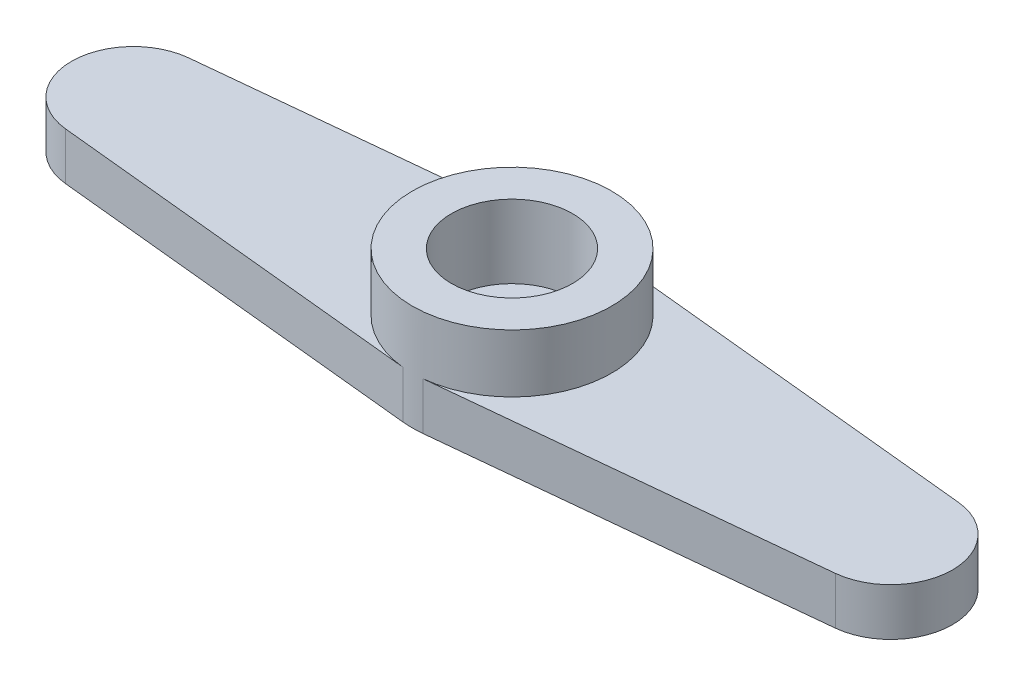
ISO-10303-21;
HEADER;
FILE_DESCRIPTION(('STEP AP214'),'2;1');
FILE_NAME('part.step','',(''),(''),'','','');
FILE_SCHEMA(('AUTOMOTIVE_DESIGN { 1 0 10303 214 1 1 1 1 }'));
ENDSEC;
DATA;
#1=APPLICATION_CONTEXT('core data for automotive mechanical design processes');
#2=APPLICATION_PROTOCOL_DEFINITION('international standard','automotive_design',2000,#1);
#3=PRODUCT_CONTEXT('',#1,'mechanical');
#4=PRODUCT('Part','Part','',(#3));
#5=PRODUCT_RELATED_PRODUCT_CATEGORY('part','',(#4));
#6=PRODUCT_DEFINITION_FORMATION('','',#4);
#7=PRODUCT_DEFINITION_CONTEXT('part definition',#1,'design');
#8=PRODUCT_DEFINITION('design','',#6,#7);
#9=PRODUCT_DEFINITION_SHAPE('','',#8);
#10=(LENGTH_UNIT() NAMED_UNIT(*) SI_UNIT(.MILLI.,.METRE.));
#11=(NAMED_UNIT(*) PLANE_ANGLE_UNIT() SI_UNIT($,.RADIAN.));
#12=(NAMED_UNIT(*) SI_UNIT($,.STERADIAN.) SOLID_ANGLE_UNIT());
#13=UNCERTAINTY_MEASURE_WITH_UNIT(LENGTH_MEASURE(1.E-05),#10,'distance_accuracy_value','');
#14=(GEOMETRIC_REPRESENTATION_CONTEXT(3) GLOBAL_UNCERTAINTY_ASSIGNED_CONTEXT((#13)) GLOBAL_UNIT_ASSIGNED_CONTEXT((#10,
#11,#12)) REPRESENTATION_CONTEXT('',''));
#15=CARTESIAN_POINT('',(0.,0.,0.));
#16=DIRECTION('',(0.,0.,1.));
#17=DIRECTION('',(1.,0.,0.));
#18=AXIS2_PLACEMENT_3D('',#15,#16,#17);
#19=CARTESIAN_POINT('',(0.,1.88,0.));
#20=DIRECTION('',(0.,1.,0.));
#21=DIRECTION('',(0.,0.,1.));
#22=AXIS2_PLACEMENT_3D('',#19,#20,#21);
#23=PLANE('',#22);
#24=CARTESIAN_POINT('',(0.,1.88,0.));
#25=DIRECTION('',(0.,1.,0.));
#26=DIRECTION('',(0.,0.,1.));
#27=AXIS2_PLACEMENT_3D('',#24,#25,#26);
#28=CIRCLE('',#27,3.95);
#29=CARTESIAN_POINT('',(0.395,1.88,3.93020037657115));
#30=VERTEX_POINT('',#29);
#31=CARTESIAN_POINT('',(0.395,1.88,-3.93020037657115));
#32=VERTEX_POINT('',#31);
#33=EDGE_CURVE('E111',#30,#32,#28,.T.);
#34=ORIENTED_EDGE('',*,*,#33,.F.);
#35=DIRECTION('',(0.99498743710662,0.,-0.1));
#36=VECTOR('',#35,1.);
#37=CARTESIAN_POINT('',(0.395,1.88,3.93020037657115));
#38=LINE('',#37,#36);
#39=CARTESIAN_POINT('',(15.245,1.88,2.43771922091122));
#40=VERTEX_POINT('',#39);
#41=EDGE_CURVE('E106',#30,#40,#38,.T.);
#42=ORIENTED_EDGE('',*,*,#41,.T.);
#43=CARTESIAN_POINT('',(15.,1.88,0.));
#44=DIRECTION('',(0.,1.,0.));
#45=DIRECTION('',(0.,0.,1.));
#46=AXIS2_PLACEMENT_3D('',#43,#44,#45);
#47=CIRCLE('',#46,2.45);
#48=CARTESIAN_POINT('',(15.245,1.88,-2.43771922091122));
#49=VERTEX_POINT('',#48);
#50=EDGE_CURVE('E109',#40,#49,#47,.T.);
#51=ORIENTED_EDGE('',*,*,#50,.T.);
#52=DIRECTION('',(-0.99498743710662,0.,-0.0999999999999999));
#53=VECTOR('',#52,1.);
#54=CARTESIAN_POINT('',(0.395,1.88,-3.93020037657115));
#55=LINE('',#54,#53);
#56=EDGE_CURVE('E52',#49,#32,#55,.T.);
#57=ORIENTED_EDGE('',*,*,#56,.T.);
#58=EDGE_LOOP('',(#34,#42,#51,#57));
#59=FACE_BOUND('',#58,.T.);
#60=ADVANCED_FACE('F33',(#59),#23,.T.);
#61=CARTESIAN_POINT('',(-0.395,1.88,-3.93020037657115));
#62=DIRECTION('',(0.1,0.,0.99498743710662));
#63=DIRECTION('',(0.99498743710662,0.,-0.1));
#64=AXIS2_PLACEMENT_3D('',#61,#62,#63);
#65=PLANE('',#64);
#66=DIRECTION('',(-0.99498743710662,0.,0.1));
#67=VECTOR('',#66,1.);
#68=CARTESIAN_POINT('',(-0.395,0.,-3.93020037657115));
#69=LINE('',#68,#67);
#70=CARTESIAN_POINT('',(-0.395,0.,-3.93020037657115));
#71=VERTEX_POINT('',#70);
#72=CARTESIAN_POINT('',(-15.245,0.,-2.43771922091122));
#73=VERTEX_POINT('',#72);
#74=EDGE_CURVE('E135',#71,#73,#69,.T.);
#75=ORIENTED_EDGE('',*,*,#74,.T.);
#76=DIRECTION('',(0.,-1.,0.));
#77=VECTOR('',#76,1.);
#78=CARTESIAN_POINT('',(-15.245,1.88,-2.43771922091122));
#79=LINE('',#78,#77);
#80=CARTESIAN_POINT('',(-15.245,1.88,-2.43771922091122));
#81=VERTEX_POINT('',#80);
#82=EDGE_CURVE('E152',#81,#73,#79,.T.);
#83=ORIENTED_EDGE('',*,*,#82,.F.);
#84=DIRECTION('',(-0.99498743710662,0.,0.1));
#85=VECTOR('',#84,1.);
#86=CARTESIAN_POINT('',(-0.395,1.88,-3.93020037657115));
#87=LINE('',#86,#85);
#88=CARTESIAN_POINT('',(-0.395,1.88,-3.93020037657115));
#89=VERTEX_POINT('',#88);
#90=EDGE_CURVE('E147',#89,#81,#87,.T.);
#91=ORIENTED_EDGE('',*,*,#90,.F.);
#92=DIRECTION('',(0.,-1.,0.));
#93=VECTOR('',#92,1.);
#94=CARTESIAN_POINT('',(-0.395,1.88,-3.93020037657115));
#95=LINE('',#94,#93);
#96=EDGE_CURVE('E43',#89,#71,#95,.T.);
#97=ORIENTED_EDGE('',*,*,#96,.T.);
#98=EDGE_LOOP('',(#75,#83,#91,#97));
#99=FACE_BOUND('',#98,.T.);
#100=ADVANCED_FACE('F35',(#99),#65,.F.);
#101=CARTESIAN_POINT('',(-15.,1.88,0.));
#102=DIRECTION('',(0.,-1.,0.));
#103=DIRECTION('',(0.,0.,-1.));
#104=AXIS2_PLACEMENT_3D('',#101,#102,#103);
#105=CYLINDRICAL_SURFACE('',#104,2.45);
#106=CARTESIAN_POINT('',(-15.,0.,0.));
#107=DIRECTION('',(0.,1.,0.));
#108=DIRECTION('',(0.,0.,1.));
#109=AXIS2_PLACEMENT_3D('',#106,#107,#108);
#110=CIRCLE('',#109,2.45);
#111=CARTESIAN_POINT('',(-15.245,0.,2.43771922091122));
#112=VERTEX_POINT('',#111);
#113=EDGE_CURVE('E138',#73,#112,#110,.T.);
#114=ORIENTED_EDGE('',*,*,#113,.T.);
#115=DIRECTION('',(0.,-1.,0.));
#116=VECTOR('',#115,1.);
#117=CARTESIAN_POINT('',(-15.245,1.88,2.43771922091122));
#118=LINE('',#117,#116);
#119=CARTESIAN_POINT('',(-15.245,1.88,2.43771922091122));
#120=VERTEX_POINT('',#119);
#121=EDGE_CURVE('E149',#120,#112,#118,.T.);
#122=ORIENTED_EDGE('',*,*,#121,.F.);
#123=CARTESIAN_POINT('',(-15.,1.88,0.));
#124=DIRECTION('',(0.,1.,0.));
#125=DIRECTION('',(0.,0.,1.));
#126=AXIS2_PLACEMENT_3D('',#123,#124,#125);
#127=CIRCLE('',#126,2.45);
#128=EDGE_CURVE('E130',#81,#120,#127,.T.);
#129=ORIENTED_EDGE('',*,*,#128,.F.);
#130=ORIENTED_EDGE('',*,*,#82,.T.);
#131=EDGE_LOOP('',(#114,#122,#129,#130));
#132=FACE_BOUND('',#131,.T.);
#133=ADVANCED_FACE('F198',(#132),#105,.T.);
#134=CARTESIAN_POINT('',(-0.395,1.88,3.93020037657115));
#135=DIRECTION('',(0.1,0.,-0.99498743710662));
#136=DIRECTION('',(-0.99498743710662,0.,-0.1));
#137=AXIS2_PLACEMENT_3D('',#134,#135,#136);
#138=PLANE('',#137);
#139=DIRECTION('',(0.99498743710662,0.,0.1));
#140=VECTOR('',#139,1.);
#141=CARTESIAN_POINT('',(-0.395,0.,3.93020037657115));
#142=LINE('',#141,#140);
#143=CARTESIAN_POINT('',(-0.395,0.,3.93020037657115));
#144=VERTEX_POINT('',#143);
#145=EDGE_CURVE('E140',#112,#144,#142,.T.);
#146=ORIENTED_EDGE('',*,*,#145,.T.);
#147=DIRECTION('',(0.,-1.,0.));
#148=VECTOR('',#147,1.);
#149=CARTESIAN_POINT('',(-0.395,1.88,3.93020037657115));
#150=LINE('',#149,#148);
#151=CARTESIAN_POINT('',(-0.395,1.88,3.93020037657115));
#152=VERTEX_POINT('',#151);
#153=EDGE_CURVE('E153',#152,#144,#150,.T.);
#154=ORIENTED_EDGE('',*,*,#153,.F.);
#155=DIRECTION('',(0.99498743710662,0.,0.1));
#156=VECTOR('',#155,1.);
#157=CARTESIAN_POINT('',(-0.395,1.88,3.93020037657115));
#158=LINE('',#157,#156);
#159=EDGE_CURVE('E115',#120,#152,#158,.T.);
#160=ORIENTED_EDGE('',*,*,#159,.F.);
#161=ORIENTED_EDGE('',*,*,#121,.T.);
#162=EDGE_LOOP('',(#146,#154,#160,#161));
#163=FACE_BOUND('',#162,.T.);
#164=ADVANCED_FACE('F194',(#163),#138,.F.);
#165=CARTESIAN_POINT('',(0.,1.88,0.));
#166=DIRECTION('',(0.,-1.,0.));
#167=DIRECTION('',(0.,0.,-1.));
#168=AXIS2_PLACEMENT_3D('',#165,#166,#167);
#169=CYLINDRICAL_SURFACE('',#168,3.95);
#170=CARTESIAN_POINT('',(0.,0.,0.));
#171=DIRECTION('',(0.,1.,0.));
#172=DIRECTION('',(0.,0.,1.));
#173=AXIS2_PLACEMENT_3D('',#170,#171,#172);
#174=CIRCLE('',#173,3.95);
#175=CARTESIAN_POINT('',(0.395,0.,3.93020037657115));
#176=VERTEX_POINT('',#175);
#177=EDGE_CURVE('E142',#144,#176,#174,.T.);
#178=ORIENTED_EDGE('',*,*,#177,.T.);
#179=DIRECTION('',(0.,-1.,0.));
#180=VECTOR('',#179,1.);
#181=CARTESIAN_POINT('',(0.395,1.88,3.93020037657115));
#182=LINE('',#181,#180);
#183=EDGE_CURVE('E121',#30,#176,#182,.T.);
#184=ORIENTED_EDGE('',*,*,#183,.F.);
#185=ORIENTED_EDGE('',*,*,#33,.T.);
#186=DIRECTION('',(0.,-1.,0.));
#187=VECTOR('',#186,1.);
#188=CARTESIAN_POINT('',(0.395,1.88,-3.93020037657115));
#189=LINE('',#188,#187);
#190=CARTESIAN_POINT('',(0.395,0.,-3.93020037657115));
#191=VERTEX_POINT('',#190);
#192=EDGE_CURVE('E126',#32,#191,#189,.T.);
#193=ORIENTED_EDGE('',*,*,#192,.T.);
#194=CARTESIAN_POINT('',(0.,0.,0.));
#195=DIRECTION('',(0.,1.,0.));
#196=DIRECTION('',(0.,0.,1.));
#197=AXIS2_PLACEMENT_3D('',#194,#195,#196);
#198=CIRCLE('',#197,3.95);
#199=EDGE_CURVE('E132',#191,#71,#198,.T.);
#200=ORIENTED_EDGE('',*,*,#199,.T.);
#201=ORIENTED_EDGE('',*,*,#96,.F.);
#202=EDGE_CURVE('E11',#89,#152,#28,.T.);
#203=ORIENTED_EDGE('',*,*,#202,.T.);
#204=ORIENTED_EDGE('',*,*,#153,.T.);
#205=EDGE_LOOP('',(#178,#184,#185,#193,#200,#201,#203,#204));
#206=FACE_BOUND('',#205,.T.);
#207=CARTESIAN_POINT('',(0.,4.18,0.));
#208=DIRECTION('',(0.,1.,0.));
#209=DIRECTION('',(0.,0.,1.));
#210=AXIS2_PLACEMENT_3D('',#207,#208,#209);
#211=CIRCLE('',#210,3.95);
#212=CARTESIAN_POINT('',(0.,4.18,3.95));
#213=VERTEX_POINT('',#212);
#214=EDGE_CURVE('E136',#213,#213,#211,.T.);
#215=ORIENTED_EDGE('',*,*,#214,.F.);
#216=EDGE_LOOP('',(#215));
#217=FACE_BOUND('',#216,.T.);
#218=ADVANCED_FACE('F181',(#206,#217),#169,.T.);
#219=CARTESIAN_POINT('',(0.395,1.88,3.93020037657115));
#220=DIRECTION('',(-0.1,0.,-0.99498743710662));
#221=DIRECTION('',(-0.99498743710662,0.,0.1));
#222=AXIS2_PLACEMENT_3D('',#219,#220,#221);
#223=PLANE('',#222);
#224=DIRECTION('',(0.99498743710662,0.,-0.1));
#225=VECTOR('',#224,1.);
#226=CARTESIAN_POINT('',(0.395,0.,3.93020037657115));
#227=LINE('',#226,#225);
#228=CARTESIAN_POINT('',(15.245,0.,2.43771922091122));
#229=VERTEX_POINT('',#228);
#230=EDGE_CURVE('E120',#176,#229,#227,.T.);
#231=ORIENTED_EDGE('',*,*,#230,.T.);
#232=DIRECTION('',(0.,-1.,0.));
#233=VECTOR('',#232,1.);
#234=CARTESIAN_POINT('',(15.245,1.88,2.43771922091122));
#235=LINE('',#234,#233);
#236=EDGE_CURVE('E117',#40,#229,#235,.T.);
#237=ORIENTED_EDGE('',*,*,#236,.F.);
#238=ORIENTED_EDGE('',*,*,#41,.F.);
#239=ORIENTED_EDGE('',*,*,#183,.T.);
#240=EDGE_LOOP('',(#231,#237,#238,#239));
#241=FACE_BOUND('',#240,.T.);
#242=ADVANCED_FACE('F118',(#241),#223,.F.);
#243=CARTESIAN_POINT('',(15.,1.88,0.));
#244=DIRECTION('',(0.,-1.,0.));
#245=DIRECTION('',(0.,0.,-1.));
#246=AXIS2_PLACEMENT_3D('',#243,#244,#245);
#247=CYLINDRICAL_SURFACE('',#246,2.45);
#248=CARTESIAN_POINT('',(15.,0.,0.));
#249=DIRECTION('',(0.,1.,0.));
#250=DIRECTION('',(0.,0.,1.));
#251=AXIS2_PLACEMENT_3D('',#248,#249,#250);
#252=CIRCLE('',#251,2.45);
#253=CARTESIAN_POINT('',(15.245,0.,-2.43771922091122));
#254=VERTEX_POINT('',#253);
#255=EDGE_CURVE('E82',#229,#254,#252,.T.);
#256=ORIENTED_EDGE('',*,*,#255,.T.);
#257=DIRECTION('',(0.,-1.,0.));
#258=VECTOR('',#257,1.);
#259=CARTESIAN_POINT('',(15.245,1.88,-2.43771922091122));
#260=LINE('',#259,#258);
#261=EDGE_CURVE('E122',#49,#254,#260,.T.);
#262=ORIENTED_EDGE('',*,*,#261,.F.);
#263=ORIENTED_EDGE('',*,*,#50,.F.);
#264=ORIENTED_EDGE('',*,*,#236,.T.);
#265=EDGE_LOOP('',(#256,#262,#263,#264));
#266=FACE_BOUND('',#265,.T.);
#267=ADVANCED_FACE('F124',(#266),#247,.T.);
#268=CARTESIAN_POINT('',(0.395,1.88,-3.93020037657115));
#269=DIRECTION('',(-0.0999999999999999,0.,0.99498743710662));
#270=DIRECTION('',(0.99498743710662,0.,0.0999999999999999));
#271=AXIS2_PLACEMENT_3D('',#268,#269,#270);
#272=PLANE('',#271);
#273=DIRECTION('',(-0.99498743710662,0.,-0.0999999999999999));
#274=VECTOR('',#273,1.);
#275=CARTESIAN_POINT('',(0.395,0.,-3.93020037657115));
#276=LINE('',#275,#274);
#277=EDGE_CURVE('E88',#254,#191,#276,.T.);
#278=ORIENTED_EDGE('',*,*,#277,.T.);
#279=ORIENTED_EDGE('',*,*,#192,.F.);
#280=ORIENTED_EDGE('',*,*,#56,.F.);
#281=ORIENTED_EDGE('',*,*,#261,.T.);
#282=EDGE_LOOP('',(#278,#279,#280,#281));
#283=FACE_BOUND('',#282,.T.);
#284=ADVANCED_FACE('F201',(#283),#272,.F.);
#285=ORIENTED_EDGE('',*,*,#202,.F.);
#286=ORIENTED_EDGE('',*,*,#90,.T.);
#287=ORIENTED_EDGE('',*,*,#128,.T.);
#288=ORIENTED_EDGE('',*,*,#159,.T.);
#289=EDGE_LOOP('',(#285,#286,#287,#288));
#290=FACE_BOUND('',#289,.T.);
#291=ADVANCED_FACE('F199',(#290),#23,.T.);
#292=CARTESIAN_POINT('',(0.,0.,0.));
#293=DIRECTION('',(0.,1.,0.));
#294=DIRECTION('',(0.,0.,1.));
#295=AXIS2_PLACEMENT_3D('',#292,#293,#294);
#296=PLANE('',#295);
#297=CARTESIAN_POINT('',(0.,0.,0.));
#298=DIRECTION('',(0.,1.,0.));
#299=DIRECTION('',(0.,0.,1.));
#300=AXIS2_PLACEMENT_3D('',#297,#298,#299);
#301=CIRCLE('',#300,1.);
#302=CARTESIAN_POINT('',(0.,0.,1.));
#303=VERTEX_POINT('',#302);
#304=EDGE_CURVE('E300',#303,#303,#301,.T.);
#305=ORIENTED_EDGE('',*,*,#304,.T.);
#306=EDGE_LOOP('',(#305));
#307=FACE_BOUND('',#306,.T.);
#308=ORIENTED_EDGE('',*,*,#199,.F.);
#309=ORIENTED_EDGE('',*,*,#277,.F.);
#310=ORIENTED_EDGE('',*,*,#255,.F.);
#311=ORIENTED_EDGE('',*,*,#230,.F.);
#312=ORIENTED_EDGE('',*,*,#177,.F.);
#313=ORIENTED_EDGE('',*,*,#145,.F.);
#314=ORIENTED_EDGE('',*,*,#113,.F.);
#315=ORIENTED_EDGE('',*,*,#74,.F.);
#316=EDGE_LOOP('',(#308,#309,#310,#311,#312,#313,#314,#315));
#317=FACE_BOUND('',#316,.T.);
#318=ADVANCED_FACE('F185',(#307,#317),#296,.F.);
#319=CARTESIAN_POINT('',(0.,4.18,0.));
#320=DIRECTION('',(0.,1.,0.));
#321=DIRECTION('',(0.,0.,1.));
#322=AXIS2_PLACEMENT_3D('',#319,#320,#321);
#323=PLANE('',#322);
#324=CARTESIAN_POINT('',(0.,4.18,0.));
#325=DIRECTION('',(0.,1.,0.));
#326=DIRECTION('',(0.,0.,1.));
#327=AXIS2_PLACEMENT_3D('',#324,#325,#326);
#328=CIRCLE('',#327,2.4);
#329=CARTESIAN_POINT('',(0.,4.18,2.4));
#330=VERTEX_POINT('',#329);
#331=EDGE_CURVE('E301',#330,#330,#328,.T.);
#332=ORIENTED_EDGE('',*,*,#331,.F.);
#333=EDGE_LOOP('',(#332));
#334=FACE_BOUND('',#333,.T.);
#335=ORIENTED_EDGE('',*,*,#214,.T.);
#336=EDGE_LOOP('',(#335));
#337=FACE_BOUND('',#336,.T.);
#338=ADVANCED_FACE('F207',(#334,#337),#323,.T.);
#339=CARTESIAN_POINT('',(0.,1.28,0.));
#340=DIRECTION('',(0.,1.,0.));
#341=DIRECTION('',(0.,0.,1.));
#342=AXIS2_PLACEMENT_3D('',#339,#340,#341);
#343=CYLINDRICAL_SURFACE('',#342,2.4);
#344=CARTESIAN_POINT('',(0.,1.28,0.));
#345=DIRECTION('',(0.,1.,0.));
#346=DIRECTION('',(0.,0.,1.));
#347=AXIS2_PLACEMENT_3D('',#344,#345,#346);
#348=CIRCLE('',#347,2.4);
#349=CARTESIAN_POINT('',(0.,1.28,2.4));
#350=VERTEX_POINT('',#349);
#351=EDGE_CURVE('E304',#350,#350,#348,.T.);
#352=ORIENTED_EDGE('',*,*,#351,.F.);
#353=EDGE_LOOP('',(#352));
#354=FACE_BOUND('',#353,.T.);
#355=ORIENTED_EDGE('',*,*,#331,.T.);
#356=EDGE_LOOP('',(#355));
#357=FACE_BOUND('',#356,.T.);
#358=ADVANCED_FACE('F254',(#354,#357),#343,.F.);
#359=CARTESIAN_POINT('',(0.,1.28,0.));
#360=DIRECTION('',(0.,1.,0.));
#361=DIRECTION('',(0.,0.,1.));
#362=AXIS2_PLACEMENT_3D('',#359,#360,#361);
#363=PLANE('',#362);
#364=CARTESIAN_POINT('',(0.,1.28,0.));
#365=DIRECTION('',(0.,1.,0.));
#366=DIRECTION('',(0.,0.,1.));
#367=AXIS2_PLACEMENT_3D('',#364,#365,#366);
#368=CIRCLE('',#367,1.);
#369=CARTESIAN_POINT('',(0.,1.28,1.));
#370=VERTEX_POINT('',#369);
#371=EDGE_CURVE('E297',#370,#370,#368,.T.);
#372=ORIENTED_EDGE('',*,*,#371,.F.);
#373=EDGE_LOOP('',(#372));
#374=FACE_BOUND('',#373,.T.);
#375=ORIENTED_EDGE('',*,*,#351,.T.);
#376=EDGE_LOOP('',(#375));
#377=FACE_BOUND('',#376,.T.);
#378=ADVANCED_FACE('F264',(#374,#377),#363,.T.);
#379=CARTESIAN_POINT('',(0.,-1.62,0.));
#380=DIRECTION('',(0.,1.,0.));
#381=DIRECTION('',(0.,0.,1.));
#382=AXIS2_PLACEMENT_3D('',#379,#380,#381);
#383=CYLINDRICAL_SURFACE('',#382,1.);
#384=ORIENTED_EDGE('',*,*,#371,.T.);
#385=EDGE_LOOP('',(#384));
#386=FACE_BOUND('',#385,.T.);
#387=ORIENTED_EDGE('',*,*,#304,.F.);
#388=EDGE_LOOP('',(#387));
#389=FACE_BOUND('',#388,.T.);
#390=ADVANCED_FACE('F280',(#386,#389),#383,.F.);
#391=CLOSED_SHELL('',(#60,#100,#133,#164,#218,#242,#267,#284,#291,#318,#338,#358,#378,#390));
#392=MANIFOLD_SOLID_BREP('B2',#391);
#393=ADVANCED_BREP_SHAPE_REPRESENTATION('',(#18,#392),#14);
#394=SHAPE_DEFINITION_REPRESENTATION(#9,#393);
ENDSEC;
END-ISO-10303-21;
